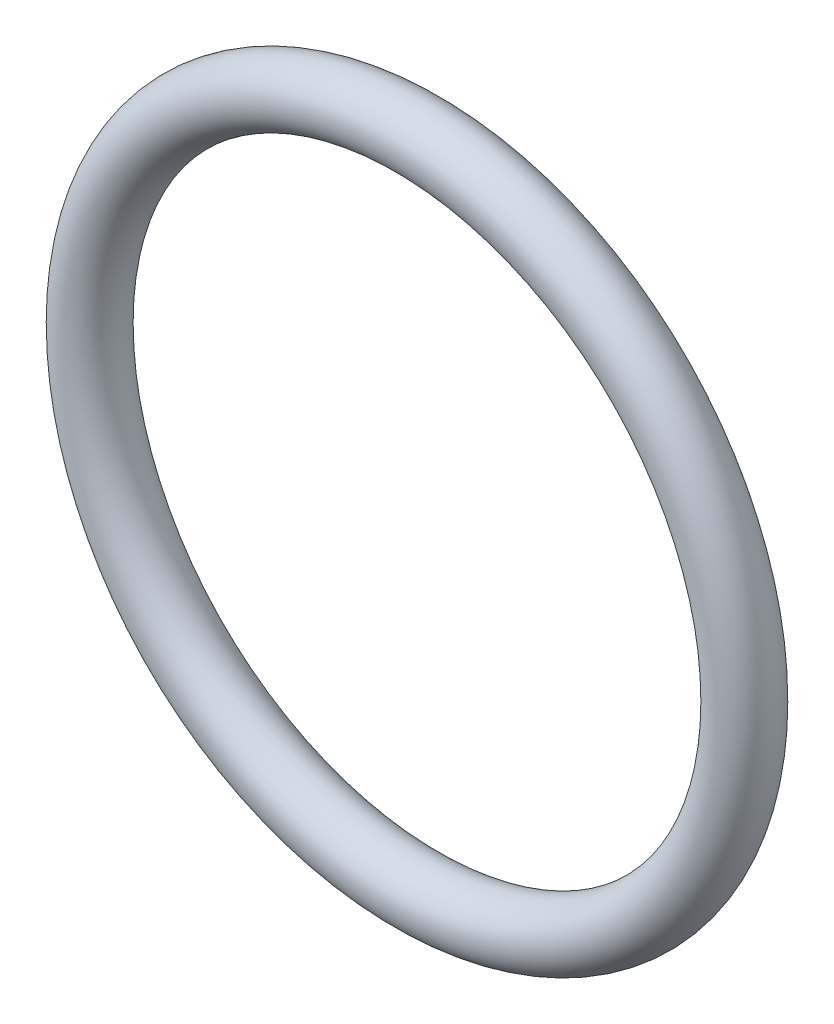
ISO-10303-21;
HEADER;
FILE_DESCRIPTION(('STEP AP214'),'2;1');
FILE_NAME('part.step','',(''),(''),'','','');
FILE_SCHEMA(('AUTOMOTIVE_DESIGN { 1 0 10303 214 1 1 1 1 }'));
ENDSEC;
DATA;
#1=APPLICATION_CONTEXT('core data for automotive mechanical design processes');
#2=APPLICATION_PROTOCOL_DEFINITION('international standard','automotive_design',2000,#1);
#3=PRODUCT_CONTEXT('',#1,'mechanical');
#4=PRODUCT('Part','Part','',(#3));
#5=PRODUCT_RELATED_PRODUCT_CATEGORY('part','',(#4));
#6=PRODUCT_DEFINITION_FORMATION('','',#4);
#7=PRODUCT_DEFINITION_CONTEXT('part definition',#1,'design');
#8=PRODUCT_DEFINITION('design','',#6,#7);
#9=PRODUCT_DEFINITION_SHAPE('','',#8);
#10=(LENGTH_UNIT() NAMED_UNIT(*) SI_UNIT(.MILLI.,.METRE.));
#11=(NAMED_UNIT(*) PLANE_ANGLE_UNIT() SI_UNIT($,.RADIAN.));
#12=(NAMED_UNIT(*) SI_UNIT($,.STERADIAN.) SOLID_ANGLE_UNIT());
#13=UNCERTAINTY_MEASURE_WITH_UNIT(LENGTH_MEASURE(1.E-05),#10,'distance_accuracy_value','');
#14=(GEOMETRIC_REPRESENTATION_CONTEXT(3) GLOBAL_UNCERTAINTY_ASSIGNED_CONTEXT((#13)) GLOBAL_UNIT_ASSIGNED_CONTEXT((#10,
#11,#12)) REPRESENTATION_CONTEXT('',''));
#15=CARTESIAN_POINT('',(0.,0.,0.));
#16=DIRECTION('',(0.,0.,1.));
#17=DIRECTION('',(1.,0.,0.));
#18=AXIS2_PLACEMENT_3D('',#15,#16,#17);
#19=CARTESIAN_POINT('',(0.,0.,0.));
#20=DIRECTION('',(0.,0.,1.));
#21=DIRECTION('',(1.,0.,0.));
#22=AXIS2_PLACEMENT_3D('',#19,#20,#21);
#23=TOROIDAL_SURFACE('',#22,9.475,0.89);
#24=CARTESIAN_POINT('',(10.365,0.,0.));
#25=VERTEX_POINT('',#24);
#26=VERTEX_LOOP('',#25);
#27=FACE_BOUND('',#26,.T.);
#28=ADVANCED_FACE('F38',(#27),#23,.T.);
#29=CLOSED_SHELL('',(#28));
#30=MANIFOLD_SOLID_BREP('B2',#29);
#31=ADVANCED_BREP_SHAPE_REPRESENTATION('',(#18,#30),#14);
#32=SHAPE_DEFINITION_REPRESENTATION(#9,#31);
ENDSEC;
END-ISO-10303-21;
